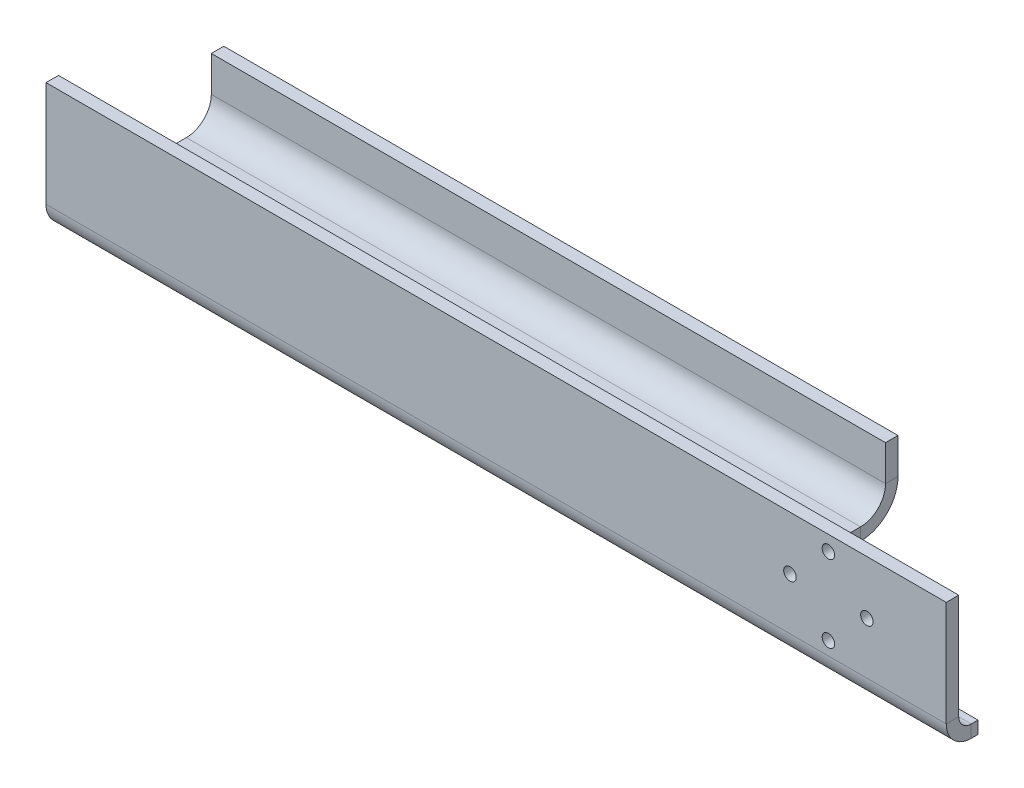
ISO-10303-21;
HEADER;
FILE_DESCRIPTION(('STEP AP214'),'2;1');
FILE_NAME('part.step','',(''),(''),'','','');
FILE_SCHEMA(('AUTOMOTIVE_DESIGN { 1 0 10303 214 1 1 1 1 }'));
ENDSEC;
DATA;
#1=APPLICATION_CONTEXT('core data for automotive mechanical design processes');
#2=APPLICATION_PROTOCOL_DEFINITION('international standard','automotive_design',2000,#1);
#3=PRODUCT_CONTEXT('',#1,'mechanical');
#4=PRODUCT('Part','Part','',(#3));
#5=PRODUCT_RELATED_PRODUCT_CATEGORY('part','',(#4));
#6=PRODUCT_DEFINITION_FORMATION('','',#4);
#7=PRODUCT_DEFINITION_CONTEXT('part definition',#1,'design');
#8=PRODUCT_DEFINITION('design','',#6,#7);
#9=PRODUCT_DEFINITION_SHAPE('','',#8);
#10=(LENGTH_UNIT() NAMED_UNIT(*) SI_UNIT(.MILLI.,.METRE.));
#11=(NAMED_UNIT(*) PLANE_ANGLE_UNIT() SI_UNIT($,.RADIAN.));
#12=(NAMED_UNIT(*) SI_UNIT($,.STERADIAN.) SOLID_ANGLE_UNIT());
#13=UNCERTAINTY_MEASURE_WITH_UNIT(LENGTH_MEASURE(1.E-05),#10,'distance_accuracy_value','');
#14=(GEOMETRIC_REPRESENTATION_CONTEXT(3) GLOBAL_UNCERTAINTY_ASSIGNED_CONTEXT((#13)) GLOBAL_UNIT_ASSIGNED_CONTEXT((#10,
#11,#12)) REPRESENTATION_CONTEXT('',''));
#15=CARTESIAN_POINT('',(0.,0.,0.));
#16=DIRECTION('',(0.,0.,1.));
#17=DIRECTION('',(1.,0.,0.));
#18=AXIS2_PLACEMENT_3D('',#15,#16,#17);
#19=CARTESIAN_POINT('',(0.,2.5,0.));
#20=DIRECTION('',(0.,1.,0.));
#21=DIRECTION('',(0.,0.,1.));
#22=AXIS2_PLACEMENT_3D('',#19,#20,#21);
#23=PLANE('',#22);
#24=CARTESIAN_POINT('',(5.44472221513645,2.5,5.44472221513638));
#25=DIRECTION('',(0.,1.,0.));
#26=DIRECTION('',(0.,0.,1.));
#27=AXIS2_PLACEMENT_3D('',#24,#25,#26);
#28=CIRCLE('',#27,1.3);
#29=CARTESIAN_POINT('',(5.44472221513645,2.5,6.74472221513639));
#30=VERTEX_POINT('',#29);
#31=EDGE_CURVE('E335',#30,#30,#28,.T.);
#32=ORIENTED_EDGE('',*,*,#31,.F.);
#33=EDGE_LOOP('',(#32));
#34=FACE_BOUND('',#33,.T.);
#35=CARTESIAN_POINT('',(-5.44472221513645,2.5,-5.44472221513639));
#36=DIRECTION('',(0.,1.,0.));
#37=DIRECTION('',(0.,0.,1.));
#38=AXIS2_PLACEMENT_3D('',#35,#36,#37);
#39=CIRCLE('',#38,1.3);
#40=CARTESIAN_POINT('',(-5.44472221513645,2.5,-4.14472221513639));
#41=VERTEX_POINT('',#40);
#42=EDGE_CURVE('E338',#41,#41,#39,.T.);
#43=ORIENTED_EDGE('',*,*,#42,.F.);
#44=EDGE_LOOP('',(#43));
#45=FACE_BOUND('',#44,.T.);
#46=CARTESIAN_POINT('',(5.44472221513639,2.5,-5.44472221513645));
#47=DIRECTION('',(0.,1.,0.));
#48=DIRECTION('',(0.,0.,1.));
#49=AXIS2_PLACEMENT_3D('',#46,#47,#48);
#50=CIRCLE('',#49,1.3);
#51=CARTESIAN_POINT('',(5.44472221513639,2.5,-4.14472221513645));
#52=VERTEX_POINT('',#51);
#53=EDGE_CURVE('E347',#52,#52,#50,.T.);
#54=ORIENTED_EDGE('',*,*,#53,.F.);
#55=EDGE_LOOP('',(#54));
#56=FACE_BOUND('',#55,.T.);
#57=CARTESIAN_POINT('',(-5.44472221513639,2.5,5.44472221513645));
#58=DIRECTION('',(0.,1.,0.));
#59=DIRECTION('',(0.,0.,1.));
#60=AXIS2_PLACEMENT_3D('',#57,#58,#59);
#61=CIRCLE('',#60,1.3);
#62=CARTESIAN_POINT('',(-5.44472221513639,2.5,6.74472221513644));
#63=VERTEX_POINT('',#62);
#64=EDGE_CURVE('E350',#63,#63,#61,.T.);
#65=ORIENTED_EDGE('',*,*,#64,.F.);
#66=EDGE_LOOP('',(#65));
#67=FACE_BOUND('',#66,.T.);
#68=DIRECTION('',(0.,0.,-1.));
#69=VECTOR('',#68,1.);
#70=CARTESIAN_POINT('',(119.20208345922,2.5,-27.));
#71=LINE('',#70,#69);
#72=CARTESIAN_POINT('',(119.20208345922,2.5,11.6459472433678));
#73=VERTEX_POINT('',#72);
#74=CARTESIAN_POINT('',(119.20208345922,2.5,-10.0912614787659));
#75=VERTEX_POINT('',#74);
#76=EDGE_CURVE('E57',#73,#75,#71,.T.);
#77=ORIENTED_EDGE('',*,*,#76,.T.);
#78=DIRECTION('',(-1.,0.,0.));
#79=VECTOR('',#78,1.);
#80=CARTESIAN_POINT('',(0.,2.5,-10.0912614787659));
#81=LINE('',#80,#79);
#82=CARTESIAN_POINT('',(-15.7697055104054,2.5,-10.0912614787659));
#83=VERTEX_POINT('',#82);
#84=EDGE_CURVE('E384',#75,#83,#81,.T.);
#85=ORIENTED_EDGE('',*,*,#84,.T.);
#86=DIRECTION('',(0.,0.,1.));
#87=VECTOR('',#86,1.);
#88=CARTESIAN_POINT('',(-15.7697055104054,2.5,-27.));
#89=LINE('',#88,#87);
#90=CARTESIAN_POINT('',(-15.7697055104054,2.5,13.0038202314015));
#91=VERTEX_POINT('',#90);
#92=EDGE_CURVE('E342',#83,#91,#89,.T.);
#93=ORIENTED_EDGE('',*,*,#92,.T.);
#94=DIRECTION('',(1.,0.,0.));
#95=VECTOR('',#94,1.);
#96=CARTESIAN_POINT('',(0.,2.5,13.0038202314015));
#97=LINE('',#96,#95);
#98=CARTESIAN_POINT('',(126.472678925557,2.5,13.0038202314015));
#99=VERTEX_POINT('',#98);
#100=EDGE_CURVE('E374',#91,#99,#97,.T.);
#101=ORIENTED_EDGE('',*,*,#100,.T.);
#102=DIRECTION('',(0.,0.,-1.));
#103=VECTOR('',#102,1.);
#104=CARTESIAN_POINT('',(126.472678925557,2.5,11.6459472433678));
#105=LINE('',#104,#103);
#106=CARTESIAN_POINT('',(126.472678925557,2.5,11.6459472433678));
#107=VERTEX_POINT('',#106);
#108=EDGE_CURVE('E346',#99,#107,#105,.T.);
#109=ORIENTED_EDGE('',*,*,#108,.T.);
#110=DIRECTION('',(-1.,0.,0.));
#111=VECTOR('',#110,1.);
#112=CARTESIAN_POINT('',(119.20208345922,2.5,11.6459472433678));
#113=LINE('',#112,#111);
#114=EDGE_CURVE('E343',#107,#73,#113,.T.);
#115=ORIENTED_EDGE('',*,*,#114,.T.);
#116=EDGE_LOOP('',(#77,#85,#93,#101,#109,#115));
#117=FACE_BOUND('',#116,.T.);
#118=ADVANCED_FACE('F53',(#34,#45,#56,#67,#117),#23,.T.);
#119=CARTESIAN_POINT('',(-15.7697055104054,2.5,-27.));
#120=DIRECTION('',(-1.,0.,0.));
#121=DIRECTION('',(0.,0.,1.));
#122=AXIS2_PLACEMENT_3D('',#119,#120,#121);
#123=PLANE('',#122);
#124=ORIENTED_EDGE('',*,*,#92,.F.);
#125=DIRECTION('',(0.,-1.,0.));
#126=VECTOR('',#125,1.);
#127=CARTESIAN_POINT('',(-15.7697055104054,2.5,-10.0912614787659));
#128=LINE('',#127,#126);
#129=CARTESIAN_POINT('',(-15.7697055104054,0.,-10.0912614787659));
#130=VERTEX_POINT('',#129);
#131=EDGE_CURVE('E12',#83,#130,#128,.T.);
#132=ORIENTED_EDGE('',*,*,#131,.T.);
#133=DIRECTION('',(0.,0.,1.));
#134=VECTOR('',#133,1.);
#135=CARTESIAN_POINT('',(-15.7697055104054,0.,0.));
#136=LINE('',#135,#134);
#137=CARTESIAN_POINT('',(-15.7697055104054,0.,13.0038202314015));
#138=VERTEX_POINT('',#137);
#139=EDGE_CURVE('E359',#130,#138,#136,.T.);
#140=ORIENTED_EDGE('',*,*,#139,.T.);
#141=DIRECTION('',(0.,1.,0.));
#142=VECTOR('',#141,1.);
#143=CARTESIAN_POINT('',(-15.7697055104054,2.5,13.0038202314015));
#144=LINE('',#143,#142);
#145=EDGE_CURVE('E377',#138,#91,#144,.T.);
#146=ORIENTED_EDGE('',*,*,#145,.T.);
#147=EDGE_LOOP('',(#124,#132,#140,#146));
#148=FACE_BOUND('',#147,.T.);
#149=ADVANCED_FACE('F55',(#148),#123,.T.);
#150=CARTESIAN_POINT('',(119.20208345922,2.5,-27.));
#151=DIRECTION('',(1.,0.,0.));
#152=DIRECTION('',(0.,0.,-1.));
#153=AXIS2_PLACEMENT_3D('',#150,#151,#152);
#154=PLANE('',#153);
#155=DIRECTION('',(0.,0.,1.));
#156=VECTOR('',#155,1.);
#157=CARTESIAN_POINT('',(119.20208345922,0.,0.));
#158=LINE('',#157,#156);
#159=CARTESIAN_POINT('',(119.20208345922,0.,11.6459472433678));
#160=VERTEX_POINT('',#159);
#161=CARTESIAN_POINT('',(119.20208345922,0.,-10.0912614787659));
#162=VERTEX_POINT('',#161);
#163=EDGE_CURVE('E363',#160,#162,#158,.F.);
#164=ORIENTED_EDGE('',*,*,#163,.T.);
#165=DIRECTION('',(0.,1.,0.));
#166=VECTOR('',#165,1.);
#167=CARTESIAN_POINT('',(119.20208345922,2.5,-10.0912614787659));
#168=LINE('',#167,#166);
#169=EDGE_CURVE('E389',#162,#75,#168,.T.);
#170=ORIENTED_EDGE('',*,*,#169,.T.);
#171=ORIENTED_EDGE('',*,*,#76,.F.);
#172=DIRECTION('',(0.,1.,0.));
#173=VECTOR('',#172,1.);
#174=CARTESIAN_POINT('',(119.20208345922,2.5,11.6459472433678));
#175=LINE('',#174,#173);
#176=EDGE_CURVE('E353',#160,#73,#175,.T.);
#177=ORIENTED_EDGE('',*,*,#176,.F.);
#178=EDGE_LOOP('',(#164,#170,#171,#177));
#179=FACE_BOUND('',#178,.T.);
#180=ADVANCED_FACE('F473',(#179),#154,.T.);
#181=CARTESIAN_POINT('',(0.,0.,0.));
#182=DIRECTION('',(0.,1.,0.));
#183=DIRECTION('',(0.,0.,1.));
#184=AXIS2_PLACEMENT_3D('',#181,#182,#183);
#185=PLANE('',#184);
#186=DIRECTION('',(-1.,0.,0.));
#187=VECTOR('',#186,1.);
#188=CARTESIAN_POINT('',(0.,0.,-10.0912614787659));
#189=LINE('',#188,#187);
#190=EDGE_CURVE('E62',#162,#130,#189,.T.);
#191=ORIENTED_EDGE('',*,*,#190,.F.);
#192=ORIENTED_EDGE('',*,*,#163,.F.);
#193=DIRECTION('',(1.,0.,0.));
#194=VECTOR('',#193,1.);
#195=CARTESIAN_POINT('',(0.,0.,11.6459472433678));
#196=LINE('',#195,#194);
#197=CARTESIAN_POINT('',(126.472678925557,0.,11.6459472433678));
#198=VERTEX_POINT('',#197);
#199=EDGE_CURVE('E360',#198,#160,#196,.F.);
#200=ORIENTED_EDGE('',*,*,#199,.F.);
#201=DIRECTION('',(0.,0.,1.));
#202=VECTOR('',#201,1.);
#203=CARTESIAN_POINT('',(126.472678925557,0.,0.));
#204=LINE('',#203,#202);
#205=CARTESIAN_POINT('',(126.472678925557,0.,13.0038202314015));
#206=VERTEX_POINT('',#205);
#207=EDGE_CURVE('E364',#206,#198,#204,.F.);
#208=ORIENTED_EDGE('',*,*,#207,.F.);
#209=DIRECTION('',(1.,0.,0.));
#210=VECTOR('',#209,1.);
#211=CARTESIAN_POINT('',(0.,0.,13.0038202314015));
#212=LINE('',#211,#210);
#213=EDGE_CURVE('E78',#138,#206,#212,.T.);
#214=ORIENTED_EDGE('',*,*,#213,.F.);
#215=ORIENTED_EDGE('',*,*,#139,.F.);
#216=EDGE_LOOP('',(#191,#192,#200,#208,#214,#215));
#217=FACE_BOUND('',#216,.T.);
#218=CARTESIAN_POINT('',(5.44472221513645,0.,5.44472221513638));
#219=DIRECTION('',(0.,1.,0.));
#220=DIRECTION('',(0.,0.,1.));
#221=AXIS2_PLACEMENT_3D('',#218,#219,#220);
#222=CIRCLE('',#221,1.3);
#223=CARTESIAN_POINT('',(5.44472221513645,0.,6.74472221513639));
#224=VERTEX_POINT('',#223);
#225=EDGE_CURVE('E306',#224,#224,#222,.T.);
#226=ORIENTED_EDGE('',*,*,#225,.T.);
#227=EDGE_LOOP('',(#226));
#228=FACE_BOUND('',#227,.T.);
#229=CARTESIAN_POINT('',(-5.44472221513645,0.,-5.44472221513639));
#230=DIRECTION('',(0.,1.,0.));
#231=DIRECTION('',(0.,0.,1.));
#232=AXIS2_PLACEMENT_3D('',#229,#230,#231);
#233=CIRCLE('',#232,1.3);
#234=CARTESIAN_POINT('',(-5.44472221513645,0.,-4.14472221513639));
#235=VERTEX_POINT('',#234);
#236=EDGE_CURVE('E356',#235,#235,#233,.T.);
#237=ORIENTED_EDGE('',*,*,#236,.T.);
#238=EDGE_LOOP('',(#237));
#239=FACE_BOUND('',#238,.T.);
#240=CARTESIAN_POINT('',(5.44472221513639,0.,-5.44472221513645));
#241=DIRECTION('',(0.,1.,0.));
#242=DIRECTION('',(0.,0.,1.));
#243=AXIS2_PLACEMENT_3D('',#240,#241,#242);
#244=CIRCLE('',#243,1.3);
#245=CARTESIAN_POINT('',(5.44472221513639,0.,-4.14472221513645));
#246=VERTEX_POINT('',#245);
#247=EDGE_CURVE('E365',#246,#246,#244,.T.);
#248=ORIENTED_EDGE('',*,*,#247,.T.);
#249=EDGE_LOOP('',(#248));
#250=FACE_BOUND('',#249,.T.);
#251=CARTESIAN_POINT('',(-5.44472221513639,0.,5.44472221513645));
#252=DIRECTION('',(0.,1.,0.));
#253=DIRECTION('',(0.,0.,1.));
#254=AXIS2_PLACEMENT_3D('',#251,#252,#253);
#255=CIRCLE('',#254,1.3);
#256=CARTESIAN_POINT('',(-5.44472221513639,0.,6.74472221513644));
#257=VERTEX_POINT('',#256);
#258=EDGE_CURVE('E339',#257,#257,#255,.T.);
#259=ORIENTED_EDGE('',*,*,#258,.T.);
#260=EDGE_LOOP('',(#259));
#261=FACE_BOUND('',#260,.T.);
#262=ADVANCED_FACE('F412',(#217,#228,#239,#250,#261),#185,.F.);
#263=CARTESIAN_POINT('',(126.472678925557,2.5,11.6459472433678));
#264=DIRECTION('',(1.,0.,0.));
#265=DIRECTION('',(0.,0.,-1.));
#266=AXIS2_PLACEMENT_3D('',#263,#264,#265);
#267=PLANE('',#266);
#268=ORIENTED_EDGE('',*,*,#108,.F.);
#269=DIRECTION('',(0.,-1.,0.));
#270=VECTOR('',#269,1.);
#271=CARTESIAN_POINT('',(126.472678925557,2.5,13.0038202314015));
#272=LINE('',#271,#270);
#273=EDGE_CURVE('E381',#99,#206,#272,.T.);
#274=ORIENTED_EDGE('',*,*,#273,.T.);
#275=ORIENTED_EDGE('',*,*,#207,.T.);
#276=DIRECTION('',(0.,1.,0.));
#277=VECTOR('',#276,1.);
#278=CARTESIAN_POINT('',(126.472678925557,2.5,11.6459472433678));
#279=LINE('',#278,#277);
#280=EDGE_CURVE('E371',#198,#107,#279,.T.);
#281=ORIENTED_EDGE('',*,*,#280,.T.);
#282=EDGE_LOOP('',(#268,#274,#275,#281));
#283=FACE_BOUND('',#282,.T.);
#284=ADVANCED_FACE('F419',(#283),#267,.T.);
#285=CARTESIAN_POINT('',(119.20208345922,2.5,11.6459472433678));
#286=DIRECTION('',(0.,0.,-1.));
#287=DIRECTION('',(-1.,0.,0.));
#288=AXIS2_PLACEMENT_3D('',#285,#286,#287);
#289=PLANE('',#288);
#290=ORIENTED_EDGE('',*,*,#280,.F.);
#291=ORIENTED_EDGE('',*,*,#199,.T.);
#292=ORIENTED_EDGE('',*,*,#176,.T.);
#293=ORIENTED_EDGE('',*,*,#114,.F.);
#294=EDGE_LOOP('',(#290,#291,#292,#293));
#295=FACE_BOUND('',#294,.T.);
#296=ADVANCED_FACE('F486',(#295),#289,.T.);
#297=CARTESIAN_POINT('',(5.44472221513645,2.5,5.44472221513638));
#298=DIRECTION('',(0.,1.,0.));
#299=DIRECTION('',(0.,0.,1.));
#300=AXIS2_PLACEMENT_3D('',#297,#298,#299);
#301=CYLINDRICAL_SURFACE('',#300,1.3);
#302=ORIENTED_EDGE('',*,*,#31,.T.);
#303=EDGE_LOOP('',(#302));
#304=FACE_BOUND('',#303,.T.);
#305=ORIENTED_EDGE('',*,*,#225,.F.);
#306=EDGE_LOOP('',(#305));
#307=FACE_BOUND('',#306,.T.);
#308=ADVANCED_FACE('F492',(#304,#307),#301,.F.);
#309=CARTESIAN_POINT('',(-5.44472221513645,2.5,-5.44472221513639));
#310=DIRECTION('',(0.,1.,0.));
#311=DIRECTION('',(0.,0.,1.));
#312=AXIS2_PLACEMENT_3D('',#309,#310,#311);
#313=CYLINDRICAL_SURFACE('',#312,1.3);
#314=ORIENTED_EDGE('',*,*,#42,.T.);
#315=EDGE_LOOP('',(#314));
#316=FACE_BOUND('',#315,.T.);
#317=ORIENTED_EDGE('',*,*,#236,.F.);
#318=EDGE_LOOP('',(#317));
#319=FACE_BOUND('',#318,.T.);
#320=ADVANCED_FACE('F498',(#316,#319),#313,.F.);
#321=CARTESIAN_POINT('',(5.44472221513639,2.5,-5.44472221513645));
#322=DIRECTION('',(0.,1.,0.));
#323=DIRECTION('',(0.,0.,1.));
#324=AXIS2_PLACEMENT_3D('',#321,#322,#323);
#325=CYLINDRICAL_SURFACE('',#324,1.3);
#326=ORIENTED_EDGE('',*,*,#53,.T.);
#327=EDGE_LOOP('',(#326));
#328=FACE_BOUND('',#327,.T.);
#329=ORIENTED_EDGE('',*,*,#247,.F.);
#330=EDGE_LOOP('',(#329));
#331=FACE_BOUND('',#330,.T.);
#332=ADVANCED_FACE('F503',(#328,#331),#325,.F.);
#333=CARTESIAN_POINT('',(-5.44472221513639,2.5,5.44472221513645));
#334=DIRECTION('',(0.,1.,0.));
#335=DIRECTION('',(0.,0.,1.));
#336=AXIS2_PLACEMENT_3D('',#333,#334,#335);
#337=CYLINDRICAL_SURFACE('',#336,1.3);
#338=ORIENTED_EDGE('',*,*,#64,.T.);
#339=EDGE_LOOP('',(#338));
#340=FACE_BOUND('',#339,.T.);
#341=ORIENTED_EDGE('',*,*,#258,.F.);
#342=EDGE_LOOP('',(#341));
#343=FACE_BOUND('',#342,.T.);
#344=ADVANCED_FACE('F505',(#340,#343),#337,.F.);
#345=CARTESIAN_POINT('',(-15.7697055104054,26.0827402990268,15.5038202314015));
#346=DIRECTION('',(0.,1.,0.));
#347=DIRECTION('',(1.,0.,0.));
#348=AXIS2_PLACEMENT_3D('',#345,#346,#347);
#349=PLANE('',#348);
#350=DIRECTION('',(1.,0.,0.));
#351=VECTOR('',#350,1.);
#352=CARTESIAN_POINT('',(0.,26.0827402990268,18.0038202314015));
#353=LINE('',#352,#351);
#354=CARTESIAN_POINT('',(-15.7697055104054,26.0827402990268,18.0038202314015));
#355=VERTEX_POINT('',#354);
#356=CARTESIAN_POINT('',(164.453532393305,26.0827402990268,18.0038202314015));
#357=VERTEX_POINT('',#356);
#358=EDGE_CURVE('E324',#355,#357,#353,.T.);
#359=ORIENTED_EDGE('',*,*,#358,.T.);
#360=DIRECTION('',(0.,0.,-1.));
#361=VECTOR('',#360,1.);
#362=CARTESIAN_POINT('',(164.453532393305,26.0827402990268,15.5038202314015));
#363=LINE('',#362,#361);
#364=CARTESIAN_POINT('',(164.453532393305,26.0827402990268,15.5038202314015));
#365=VERTEX_POINT('',#364);
#366=EDGE_CURVE('E322',#357,#365,#363,.T.);
#367=ORIENTED_EDGE('',*,*,#366,.T.);
#368=DIRECTION('',(1.,0.,0.));
#369=VECTOR('',#368,1.);
#370=CARTESIAN_POINT('',(-15.7697055104054,26.0827402990268,15.5038202314015));
#371=LINE('',#370,#369);
#372=CARTESIAN_POINT('',(-15.7697055104054,26.0827402990268,15.5038202314015));
#373=VERTEX_POINT('',#372);
#374=EDGE_CURVE('E317',#373,#365,#371,.T.);
#375=ORIENTED_EDGE('',*,*,#374,.F.);
#376=DIRECTION('',(0.,0.,-1.));
#377=VECTOR('',#376,1.);
#378=CARTESIAN_POINT('',(-15.7697055104054,26.0827402990268,15.5038202314015));
#379=LINE('',#378,#377);
#380=EDGE_CURVE('E310',#355,#373,#379,.T.);
#381=ORIENTED_EDGE('',*,*,#380,.F.);
#382=EDGE_LOOP('',(#359,#367,#375,#381));
#383=FACE_BOUND('',#382,.T.);
#384=ADVANCED_FACE('F507',(#383),#349,.T.);
#385=CARTESIAN_POINT('',(0.,-13.8943064568824,15.5038202314016));
#386=DIRECTION('',(0.,0.,-1.));
#387=DIRECTION('',(0.,1.,0.));
#388=AXIS2_PLACEMENT_3D('',#385,#386,#387);
#389=PLANE('',#388);
#390=CARTESIAN_POINT('',(140.861538461537,23.0712554562547,15.5038202314015));
#391=DIRECTION('',(0.,0.,-1.));
#392=DIRECTION('',(0.,1.,0.));
#393=AXIS2_PLACEMENT_3D('',#390,#391,#392);
#394=CIRCLE('',#393,1.25000000000001);
#395=CARTESIAN_POINT('',(140.861538461537,24.3212554562547,15.5038202314015));
#396=VERTEX_POINT('',#395);
#397=EDGE_CURVE('E977',#396,#396,#394,.T.);
#398=ORIENTED_EDGE('',*,*,#397,.F.);
#399=EDGE_LOOP('',(#398));
#400=FACE_BOUND('',#399,.T.);
#401=CARTESIAN_POINT('',(133.161538461537,15.3712554562547,15.5038202314015));
#402=DIRECTION('',(0.,0.,-1.));
#403=DIRECTION('',(0.,1.,0.));
#404=AXIS2_PLACEMENT_3D('',#401,#402,#403);
#405=CIRCLE('',#404,1.25000000000001);
#406=CARTESIAN_POINT('',(133.161538461537,16.6212554562547,15.5038202314015));
#407=VERTEX_POINT('',#406);
#408=EDGE_CURVE('E978',#407,#407,#405,.T.);
#409=ORIENTED_EDGE('',*,*,#408,.F.);
#410=EDGE_LOOP('',(#409));
#411=FACE_BOUND('',#410,.T.);
#412=CARTESIAN_POINT('',(140.861538461537,7.67125545625473,15.5038202314015));
#413=DIRECTION('',(0.,0.,-1.));
#414=DIRECTION('',(0.,1.,0.));
#415=AXIS2_PLACEMENT_3D('',#412,#413,#414);
#416=CIRCLE('',#415,1.25000000000001);
#417=CARTESIAN_POINT('',(140.861538461537,8.92125545625474,15.5038202314015));
#418=VERTEX_POINT('',#417);
#419=EDGE_CURVE('E987',#418,#418,#416,.T.);
#420=ORIENTED_EDGE('',*,*,#419,.F.);
#421=EDGE_LOOP('',(#420));
#422=FACE_BOUND('',#421,.T.);
#423=CARTESIAN_POINT('',(148.561538461537,15.3712554562547,15.5038202314015));
#424=DIRECTION('',(0.,0.,-1.));
#425=DIRECTION('',(0.,1.,0.));
#426=AXIS2_PLACEMENT_3D('',#423,#424,#425);
#427=CIRCLE('',#426,1.25000000000001);
#428=CARTESIAN_POINT('',(148.561538461537,16.6212554562547,15.5038202314015));
#429=VERTEX_POINT('',#428);
#430=EDGE_CURVE('E993',#429,#429,#427,.T.);
#431=ORIENTED_EDGE('',*,*,#430,.F.);
#432=EDGE_LOOP('',(#431));
#433=FACE_BOUND('',#432,.T.);
#434=DIRECTION('',(1.,0.,0.));
#435=VECTOR('',#434,1.);
#436=CARTESIAN_POINT('',(0.,4.99999999999999,15.5038202314015));
#437=LINE('',#436,#435);
#438=CARTESIAN_POINT('',(-15.7697055104054,5.,15.5038202314015));
#439=VERTEX_POINT('',#438);
#440=CARTESIAN_POINT('',(164.453532393305,5.00000000000001,15.5038202314015));
#441=VERTEX_POINT('',#440);
#442=EDGE_CURVE('E303',#439,#441,#437,.T.);
#443=ORIENTED_EDGE('',*,*,#442,.F.);
#444=DIRECTION('',(0.,1.,0.));
#445=VECTOR('',#444,1.);
#446=CARTESIAN_POINT('',(-15.7697055104053,-40.8943064568824,15.5038202314017));
#447=LINE('',#446,#445);
#448=EDGE_CURVE('E320',#439,#373,#447,.T.);
#449=ORIENTED_EDGE('',*,*,#448,.T.);
#450=ORIENTED_EDGE('',*,*,#374,.T.);
#451=DIRECTION('',(0.,-1.,0.));
#452=VECTOR('',#451,1.);
#453=CARTESIAN_POINT('',(164.453532393305,26.0827402990268,15.5038202314015));
#454=LINE('',#453,#452);
#455=EDGE_CURVE('E315',#365,#441,#454,.T.);
#456=ORIENTED_EDGE('',*,*,#455,.T.);
#457=EDGE_LOOP('',(#443,#449,#450,#456));
#458=FACE_BOUND('',#457,.T.);
#459=ADVANCED_FACE('F511',(#400,#411,#422,#433,#458),#389,.T.);
#460=CARTESIAN_POINT('',(-15.7697055104053,-40.8943064568824,15.5038202314017));
#461=DIRECTION('',(-1.,0.,0.));
#462=DIRECTION('',(0.,1.,0.));
#463=AXIS2_PLACEMENT_3D('',#460,#461,#462);
#464=PLANE('',#463);
#465=DIRECTION('',(0.,0.,-1.));
#466=VECTOR('',#465,1.);
#467=CARTESIAN_POINT('',(-15.7697055104054,4.99999999999999,15.5038202314015));
#468=LINE('',#467,#466);
#469=CARTESIAN_POINT('',(-15.7697055104054,5.,18.0038202314016));
#470=VERTEX_POINT('',#469);
#471=EDGE_CURVE('E327',#470,#439,#468,.T.);
#472=ORIENTED_EDGE('',*,*,#471,.F.);
#473=DIRECTION('',(0.,1.,0.));
#474=VECTOR('',#473,1.);
#475=CARTESIAN_POINT('',(-15.7697055104054,-13.8943064568824,18.0038202314016));
#476=LINE('',#475,#474);
#477=EDGE_CURVE('E313',#470,#355,#476,.T.);
#478=ORIENTED_EDGE('',*,*,#477,.T.);
#479=ORIENTED_EDGE('',*,*,#380,.T.);
#480=ORIENTED_EDGE('',*,*,#448,.F.);
#481=EDGE_LOOP('',(#472,#478,#479,#480));
#482=FACE_BOUND('',#481,.T.);
#483=ADVANCED_FACE('F523',(#482),#464,.T.);
#484=CARTESIAN_POINT('',(0.,-13.8943064568824,18.0038202314016));
#485=DIRECTION('',(0.,0.,-1.));
#486=DIRECTION('',(0.,1.,0.));
#487=AXIS2_PLACEMENT_3D('',#484,#485,#486);
#488=PLANE('',#487);
#489=CARTESIAN_POINT('',(140.861538461537,23.0712554562547,18.0038202314016));
#490=DIRECTION('',(0.,0.,-1.));
#491=DIRECTION('',(0.,1.,0.));
#492=AXIS2_PLACEMENT_3D('',#489,#490,#491);
#493=CIRCLE('',#492,1.25000000000001);
#494=CARTESIAN_POINT('',(140.861538461537,24.3212554562548,18.0038202314016));
#495=VERTEX_POINT('',#494);
#496=EDGE_CURVE('E230',#495,#495,#493,.T.);
#497=ORIENTED_EDGE('',*,*,#496,.T.);
#498=EDGE_LOOP('',(#497));
#499=FACE_BOUND('',#498,.T.);
#500=CARTESIAN_POINT('',(133.161538461537,15.3712554562547,18.0038202314016));
#501=DIRECTION('',(0.,0.,-1.));
#502=DIRECTION('',(0.,1.,0.));
#503=AXIS2_PLACEMENT_3D('',#500,#501,#502);
#504=CIRCLE('',#503,1.25000000000001);
#505=CARTESIAN_POINT('',(133.161538461537,16.6212554562547,18.0038202314016));
#506=VERTEX_POINT('',#505);
#507=EDGE_CURVE('E982',#506,#506,#504,.T.);
#508=ORIENTED_EDGE('',*,*,#507,.T.);
#509=EDGE_LOOP('',(#508));
#510=FACE_BOUND('',#509,.T.);
#511=CARTESIAN_POINT('',(140.861538461537,7.67125545625474,18.0038202314016));
#512=DIRECTION('',(0.,0.,-1.));
#513=DIRECTION('',(0.,1.,0.));
#514=AXIS2_PLACEMENT_3D('',#511,#512,#513);
#515=CIRCLE('',#514,1.25000000000001);
#516=CARTESIAN_POINT('',(140.861538461537,8.92125545625475,18.0038202314016));
#517=VERTEX_POINT('',#516);
#518=EDGE_CURVE('E990',#517,#517,#515,.T.);
#519=ORIENTED_EDGE('',*,*,#518,.T.);
#520=EDGE_LOOP('',(#519));
#521=FACE_BOUND('',#520,.T.);
#522=CARTESIAN_POINT('',(148.561538461537,15.3712554562547,18.0038202314016));
#523=DIRECTION('',(0.,0.,-1.));
#524=DIRECTION('',(0.,1.,0.));
#525=AXIS2_PLACEMENT_3D('',#522,#523,#524);
#526=CIRCLE('',#525,1.25000000000001);
#527=CARTESIAN_POINT('',(148.561538461537,16.6212554562548,18.0038202314016));
#528=VERTEX_POINT('',#527);
#529=EDGE_CURVE('E996',#528,#528,#526,.T.);
#530=ORIENTED_EDGE('',*,*,#529,.T.);
#531=EDGE_LOOP('',(#530));
#532=FACE_BOUND('',#531,.T.);
#533=ORIENTED_EDGE('',*,*,#477,.F.);
#534=DIRECTION('',(1.,0.,0.));
#535=VECTOR('',#534,1.);
#536=CARTESIAN_POINT('',(0.,5.,18.0038202314016));
#537=LINE('',#536,#535);
#538=CARTESIAN_POINT('',(164.453532393305,5.,18.0038202314015));
#539=VERTEX_POINT('',#538);
#540=EDGE_CURVE('E307',#470,#539,#537,.T.);
#541=ORIENTED_EDGE('',*,*,#540,.T.);
#542=DIRECTION('',(0.,1.,0.));
#543=VECTOR('',#542,1.);
#544=CARTESIAN_POINT('',(164.453532393305,-13.8943064568824,18.0038202314016));
#545=LINE('',#544,#543);
#546=EDGE_CURVE('E304',#357,#539,#545,.F.);
#547=ORIENTED_EDGE('',*,*,#546,.F.);
#548=ORIENTED_EDGE('',*,*,#358,.F.);
#549=EDGE_LOOP('',(#533,#541,#547,#548));
#550=FACE_BOUND('',#549,.T.);
#551=ADVANCED_FACE('F530',(#499,#510,#521,#532,#550),#488,.F.);
#552=CARTESIAN_POINT('',(164.453532393305,26.0827402990268,15.5038202314015));
#553=DIRECTION('',(1.,0.,0.));
#554=DIRECTION('',(0.,-1.,0.));
#555=AXIS2_PLACEMENT_3D('',#552,#553,#554);
#556=PLANE('',#555);
#557=DIRECTION('',(0.,0.,1.));
#558=VECTOR('',#557,1.);
#559=CARTESIAN_POINT('',(164.453532393305,4.99999999999999,15.5038202314015));
#560=LINE('',#559,#558);
#561=EDGE_CURVE('E330',#441,#539,#560,.T.);
#562=ORIENTED_EDGE('',*,*,#561,.F.);
#563=ORIENTED_EDGE('',*,*,#455,.F.);
#564=ORIENTED_EDGE('',*,*,#366,.F.);
#565=ORIENTED_EDGE('',*,*,#546,.T.);
#566=EDGE_LOOP('',(#562,#563,#564,#565));
#567=FACE_BOUND('',#566,.T.);
#568=ADVANCED_FACE('F534',(#567),#556,.T.);
#569=CARTESIAN_POINT('',(-15.7697055104054,5.,13.0038202314015));
#570=DIRECTION('',(1.,0.,0.));
#571=DIRECTION('',(0.,0.,-1.));
#572=AXIS2_PLACEMENT_3D('',#569,#570,#571);
#573=PLANE('',#572);
#574=ORIENTED_EDGE('',*,*,#145,.F.);
#575=CARTESIAN_POINT('',(-15.7697055104054,5.,13.0038202314015));
#576=DIRECTION('',(1.,0.,0.));
#577=DIRECTION('',(0.,0.,-1.));
#578=AXIS2_PLACEMENT_3D('',#575,#576,#577);
#579=CIRCLE('',#578,5.);
#580=EDGE_CURVE('E243',#138,#470,#579,.F.);
#581=ORIENTED_EDGE('',*,*,#580,.T.);
#582=ORIENTED_EDGE('',*,*,#471,.T.);
#583=CARTESIAN_POINT('',(-15.7697055104054,5.,13.0038202314015));
#584=DIRECTION('',(-1.,0.,0.));
#585=DIRECTION('',(0.,0.,1.));
#586=AXIS2_PLACEMENT_3D('',#583,#584,#585);
#587=CIRCLE('',#586,2.5);
#588=EDGE_CURVE('E271',#91,#439,#587,.T.);
#589=ORIENTED_EDGE('',*,*,#588,.F.);
#590=EDGE_LOOP('',(#574,#581,#582,#589));
#591=FACE_BOUND('',#590,.T.);
#592=ADVANCED_FACE('F404',(#591),#573,.F.);
#593=CARTESIAN_POINT('',(164.453532393305,5.,13.0038202314015));
#594=DIRECTION('',(-1.,0.,0.));
#595=DIRECTION('',(0.,0.,1.));
#596=AXIS2_PLACEMENT_3D('',#593,#594,#595);
#597=PLANE('',#596);
#598=ORIENTED_EDGE('',*,*,#561,.T.);
#599=CARTESIAN_POINT('',(164.453532393305,5.,13.0038202314015));
#600=DIRECTION('',(1.,0.,0.));
#601=DIRECTION('',(0.,0.,-1.));
#602=AXIS2_PLACEMENT_3D('',#599,#600,#601);
#603=CIRCLE('',#602,5.);
#604=CARTESIAN_POINT('',(164.453532393305,0.,13.0038202314015));
#605=VERTEX_POINT('',#604);
#606=EDGE_CURVE('E295',#539,#605,#603,.T.);
#607=ORIENTED_EDGE('',*,*,#606,.T.);
#608=DIRECTION('',(0.,-1.,0.));
#609=VECTOR('',#608,1.);
#610=CARTESIAN_POINT('',(164.453532393305,2.5,13.0038202314015));
#611=LINE('',#610,#609);
#612=CARTESIAN_POINT('',(164.453532393305,2.5,13.0038202314015));
#613=VERTEX_POINT('',#612);
#614=EDGE_CURVE('E251',#613,#605,#611,.T.);
#615=ORIENTED_EDGE('',*,*,#614,.F.);
#616=CARTESIAN_POINT('',(164.453532393305,5.,13.0038202314015));
#617=DIRECTION('',(1.,0.,0.));
#618=DIRECTION('',(0.,0.,-1.));
#619=AXIS2_PLACEMENT_3D('',#616,#617,#618);
#620=CIRCLE('',#619,2.5);
#621=EDGE_CURVE('E274',#441,#613,#620,.T.);
#622=ORIENTED_EDGE('',*,*,#621,.F.);
#623=EDGE_LOOP('',(#598,#607,#615,#622));
#624=FACE_BOUND('',#623,.T.);
#625=ADVANCED_FACE('F444',(#624),#597,.F.);
#626=CARTESIAN_POINT('',(156.140604556731,5.,13.0038202314015));
#627=DIRECTION('',(1.,0.,0.));
#628=DIRECTION('',(0.,0.,-1.));
#629=AXIS2_PLACEMENT_3D('',#626,#627,#628);
#630=PLANE('',#629);
#631=DIRECTION('',(0.,1.,0.));
#632=VECTOR('',#631,1.);
#633=CARTESIAN_POINT('',(156.140604556731,2.5,13.0038202314015));
#634=LINE('',#633,#632);
#635=CARTESIAN_POINT('',(156.140604556731,0.,13.0038202314015));
#636=VERTEX_POINT('',#635);
#637=CARTESIAN_POINT('',(156.140604556731,2.5,13.0038202314015));
#638=VERTEX_POINT('',#637);
#639=EDGE_CURVE('E241',#636,#638,#634,.T.);
#640=ORIENTED_EDGE('',*,*,#639,.F.);
#641=CARTESIAN_POINT('',(156.140604556731,5.,13.0038202314015));
#642=DIRECTION('',(1.,0.,0.));
#643=DIRECTION('',(0.,0.,-1.));
#644=AXIS2_PLACEMENT_3D('',#641,#642,#643);
#645=CIRCLE('',#644,5.);
#646=CARTESIAN_POINT('',(156.140604556731,0.666013758597375,15.4971239151378));
#647=VERTEX_POINT('',#646);
#648=EDGE_CURVE('E292',#636,#647,#645,.F.);
#649=ORIENTED_EDGE('',*,*,#648,.T.);
#650=DIRECTION('',(0.,0.866797248280525,-0.49866073674725));
#651=VECTOR('',#650,1.);
#652=CARTESIAN_POINT('',(156.140604556731,2.83300687929869,14.2504720732696));
#653=LINE('',#652,#651);
#654=CARTESIAN_POINT('',(156.140604556731,2.83300687929869,14.2504720732696));
#655=VERTEX_POINT('',#654);
#656=EDGE_CURVE('E301',#647,#655,#653,.T.);
#657=ORIENTED_EDGE('',*,*,#656,.T.);
#658=CARTESIAN_POINT('',(156.140604556731,5.,13.0038202314015));
#659=DIRECTION('',(-1.,0.,0.));
#660=DIRECTION('',(0.,0.,1.));
#661=AXIS2_PLACEMENT_3D('',#658,#659,#660);
#662=CIRCLE('',#661,2.5);
#663=EDGE_CURVE('E278',#638,#655,#662,.T.);
#664=ORIENTED_EDGE('',*,*,#663,.F.);
#665=EDGE_LOOP('',(#640,#649,#657,#664));
#666=FACE_BOUND('',#665,.T.);
#667=ADVANCED_FACE('F431',(#666),#630,.F.);
#668=CARTESIAN_POINT('',(141.306641741144,2.83300687929869,14.2504720732696));
#669=DIRECTION('',(0.,0.498660736747249,0.866797248280525));
#670=DIRECTION('',(-1.,0.,0.));
#671=AXIS2_PLACEMENT_3D('',#668,#669,#670);
#672=PLANE('',#671);
#673=ORIENTED_EDGE('',*,*,#656,.F.);
#674=DIRECTION('',(1.,0.,0.));
#675=VECTOR('',#674,1.);
#676=CARTESIAN_POINT('',(-20.039736721453,0.666013758597375,15.4971239151378));
#677=LINE('',#676,#675);
#678=CARTESIAN_POINT('',(126.472678925557,0.666013758597375,15.4971239151378));
#679=VERTEX_POINT('',#678);
#680=EDGE_CURVE('E289',#647,#679,#677,.F.);
#681=ORIENTED_EDGE('',*,*,#680,.T.);
#682=DIRECTION('',(0.,0.866797248280526,-0.498660736747249));
#683=VECTOR('',#682,1.);
#684=CARTESIAN_POINT('',(126.472678925557,2.83300687929869,14.2504720732696));
#685=LINE('',#684,#683);
#686=CARTESIAN_POINT('',(126.472678925557,2.83300687929869,14.2504720732696));
#687=VERTEX_POINT('',#686);
#688=EDGE_CURVE('E287',#679,#687,#685,.T.);
#689=ORIENTED_EDGE('',*,*,#688,.T.);
#690=DIRECTION('',(-1.,0.,0.));
#691=VECTOR('',#690,1.);
#692=CARTESIAN_POINT('',(156.140604556731,2.83300687929869,14.2504720732696));
#693=LINE('',#692,#691);
#694=EDGE_CURVE('E281',#655,#687,#693,.T.);
#695=ORIENTED_EDGE('',*,*,#694,.F.);
#696=EDGE_LOOP('',(#673,#681,#689,#695));
#697=FACE_BOUND('',#696,.T.);
#698=ADVANCED_FACE('F426',(#697),#672,.F.);
#699=CARTESIAN_POINT('',(126.472678925557,5.,13.0038202314015));
#700=DIRECTION('',(-1.,0.,0.));
#701=DIRECTION('',(0.,0.,1.));
#702=AXIS2_PLACEMENT_3D('',#699,#700,#701);
#703=PLANE('',#702);
#704=ORIENTED_EDGE('',*,*,#688,.F.);
#705=CARTESIAN_POINT('',(126.472678925557,5.,13.0038202314015));
#706=DIRECTION('',(1.,0.,0.));
#707=DIRECTION('',(0.,0.,-1.));
#708=AXIS2_PLACEMENT_3D('',#705,#706,#707);
#709=CIRCLE('',#708,5.);
#710=EDGE_CURVE('E275',#679,#206,#709,.T.);
#711=ORIENTED_EDGE('',*,*,#710,.T.);
#712=ORIENTED_EDGE('',*,*,#273,.F.);
#713=CARTESIAN_POINT('',(126.472678925557,5.,13.0038202314015));
#714=DIRECTION('',(1.,0.,0.));
#715=DIRECTION('',(0.,0.,-1.));
#716=AXIS2_PLACEMENT_3D('',#713,#714,#715);
#717=CIRCLE('',#716,2.5);
#718=EDGE_CURVE('E284',#687,#99,#717,.T.);
#719=ORIENTED_EDGE('',*,*,#718,.F.);
#720=EDGE_LOOP('',(#704,#711,#712,#719));
#721=FACE_BOUND('',#720,.T.);
#722=ADVANCED_FACE('F421',(#721),#703,.F.);
#723=CARTESIAN_POINT('',(-20.039736721453,5.,13.0038202314015));
#724=DIRECTION('',(1.,0.,0.));
#725=DIRECTION('',(0.,0.,-1.));
#726=AXIS2_PLACEMENT_3D('',#723,#724,#725);
#727=CYLINDRICAL_SURFACE('',#726,2.5);
#728=ORIENTED_EDGE('',*,*,#718,.T.);
#729=ORIENTED_EDGE('',*,*,#100,.F.);
#730=ORIENTED_EDGE('',*,*,#588,.T.);
#731=ORIENTED_EDGE('',*,*,#442,.T.);
#732=ORIENTED_EDGE('',*,*,#621,.T.);
#733=DIRECTION('',(1.,0.,0.));
#734=VECTOR('',#733,1.);
#735=CARTESIAN_POINT('',(0.,2.5,13.0038202314015));
#736=LINE('',#735,#734);
#737=EDGE_CURVE('E259',#638,#613,#736,.T.);
#738=ORIENTED_EDGE('',*,*,#737,.F.);
#739=ORIENTED_EDGE('',*,*,#663,.T.);
#740=ORIENTED_EDGE('',*,*,#694,.T.);
#741=EDGE_LOOP('',(#728,#729,#730,#731,#732,#738,#739,#740));
#742=FACE_BOUND('',#741,.T.);
#743=ADVANCED_FACE('F407',(#742),#727,.F.);
#744=CARTESIAN_POINT('',(-20.039736721453,5.,13.0038202314015));
#745=DIRECTION('',(1.,0.,0.));
#746=DIRECTION('',(0.,0.,-1.));
#747=AXIS2_PLACEMENT_3D('',#744,#745,#746);
#748=CYLINDRICAL_SURFACE('',#747,5.);
#749=ORIENTED_EDGE('',*,*,#710,.F.);
#750=ORIENTED_EDGE('',*,*,#680,.F.);
#751=ORIENTED_EDGE('',*,*,#648,.F.);
#752=DIRECTION('',(1.,0.,0.));
#753=VECTOR('',#752,1.);
#754=CARTESIAN_POINT('',(0.,0.,13.0038202314015));
#755=LINE('',#754,#753);
#756=EDGE_CURVE('E237',#636,#605,#755,.T.);
#757=ORIENTED_EDGE('',*,*,#756,.T.);
#758=ORIENTED_EDGE('',*,*,#606,.F.);
#759=ORIENTED_EDGE('',*,*,#540,.F.);
#760=ORIENTED_EDGE('',*,*,#580,.F.);
#761=ORIENTED_EDGE('',*,*,#213,.T.);
#762=EDGE_LOOP('',(#749,#750,#751,#757,#758,#759,#760,#761));
#763=FACE_BOUND('',#762,.T.);
#764=ADVANCED_FACE('F423',(#763),#748,.T.);
#765=CARTESIAN_POINT('',(156.140604556731,2.5,11.6459472433678));
#766=DIRECTION('',(0.,0.,-1.));
#767=DIRECTION('',(-1.,0.,0.));
#768=AXIS2_PLACEMENT_3D('',#765,#766,#767);
#769=PLANE('',#768);
#770=DIRECTION('',(0.,1.,0.));
#771=VECTOR('',#770,1.);
#772=CARTESIAN_POINT('',(164.453532393305,2.5,11.6459472433678));
#773=LINE('',#772,#771);
#774=CARTESIAN_POINT('',(164.453532393305,0.,11.6459472433678));
#775=VERTEX_POINT('',#774);
#776=CARTESIAN_POINT('',(164.453532393305,2.5,11.6459472433678));
#777=VERTEX_POINT('',#776);
#778=EDGE_CURVE('E246',#775,#777,#773,.T.);
#779=ORIENTED_EDGE('',*,*,#778,.F.);
#780=DIRECTION('',(1.,0.,0.));
#781=VECTOR('',#780,1.);
#782=CARTESIAN_POINT('',(0.,0.,11.6459472433678));
#783=LINE('',#782,#781);
#784=CARTESIAN_POINT('',(156.140604556731,0.,11.6459472433678));
#785=VERTEX_POINT('',#784);
#786=EDGE_CURVE('E266',#775,#785,#783,.F.);
#787=ORIENTED_EDGE('',*,*,#786,.T.);
#788=DIRECTION('',(0.,1.,0.));
#789=VECTOR('',#788,1.);
#790=CARTESIAN_POINT('',(156.140604556731,2.5,11.6459472433678));
#791=LINE('',#790,#789);
#792=CARTESIAN_POINT('',(156.140604556731,2.5,11.6459472433678));
#793=VERTEX_POINT('',#792);
#794=EDGE_CURVE('E264',#785,#793,#791,.T.);
#795=ORIENTED_EDGE('',*,*,#794,.T.);
#796=DIRECTION('',(-1.,0.,0.));
#797=VECTOR('',#796,1.);
#798=CARTESIAN_POINT('',(156.140604556731,2.5,11.6459472433678));
#799=LINE('',#798,#797);
#800=EDGE_CURVE('E254',#777,#793,#799,.T.);
#801=ORIENTED_EDGE('',*,*,#800,.F.);
#802=EDGE_LOOP('',(#779,#787,#795,#801));
#803=FACE_BOUND('',#802,.T.);
#804=ADVANCED_FACE('F456',(#803),#769,.T.);
#805=CARTESIAN_POINT('',(0.,2.5,0.));
#806=DIRECTION('',(0.,1.,0.));
#807=DIRECTION('',(0.,0.,1.));
#808=AXIS2_PLACEMENT_3D('',#805,#806,#807);
#809=PLANE('',#808);
#810=DIRECTION('',(0.,0.,1.));
#811=VECTOR('',#810,1.);
#812=CARTESIAN_POINT('',(156.140604556731,2.5,11.6459472433678));
#813=LINE('',#812,#811);
#814=EDGE_CURVE('E261',#793,#638,#813,.T.);
#815=ORIENTED_EDGE('',*,*,#814,.T.);
#816=ORIENTED_EDGE('',*,*,#737,.T.);
#817=DIRECTION('',(0.,0.,-1.));
#818=VECTOR('',#817,1.);
#819=CARTESIAN_POINT('',(164.453532393305,2.5,39.9770467559092));
#820=LINE('',#819,#818);
#821=EDGE_CURVE('E257',#613,#777,#820,.T.);
#822=ORIENTED_EDGE('',*,*,#821,.T.);
#823=ORIENTED_EDGE('',*,*,#800,.T.);
#824=EDGE_LOOP('',(#815,#816,#822,#823));
#825=FACE_BOUND('',#824,.T.);
#826=ADVANCED_FACE('F436',(#825),#809,.T.);
#827=CARTESIAN_POINT('',(164.453532393305,2.5,39.9770467559092));
#828=DIRECTION('',(1.,0.,0.));
#829=DIRECTION('',(0.,0.,-1.));
#830=AXIS2_PLACEMENT_3D('',#827,#828,#829);
#831=PLANE('',#830);
#832=ORIENTED_EDGE('',*,*,#821,.F.);
#833=ORIENTED_EDGE('',*,*,#614,.T.);
#834=DIRECTION('',(0.,0.,1.));
#835=VECTOR('',#834,1.);
#836=CARTESIAN_POINT('',(164.453532393305,0.,0.));
#837=LINE('',#836,#835);
#838=EDGE_CURVE('E249',#605,#775,#837,.F.);
#839=ORIENTED_EDGE('',*,*,#838,.T.);
#840=ORIENTED_EDGE('',*,*,#778,.T.);
#841=EDGE_LOOP('',(#832,#833,#839,#840));
#842=FACE_BOUND('',#841,.T.);
#843=ADVANCED_FACE('F440',(#842),#831,.T.);
#844=CARTESIAN_POINT('',(0.,0.,0.));
#845=DIRECTION('',(0.,1.,0.));
#846=DIRECTION('',(0.,0.,1.));
#847=AXIS2_PLACEMENT_3D('',#844,#845,#846);
#848=PLANE('',#847);
#849=ORIENTED_EDGE('',*,*,#756,.F.);
#850=DIRECTION('',(0.,0.,1.));
#851=VECTOR('',#850,1.);
#852=CARTESIAN_POINT('',(156.140604556731,0.,0.));
#853=LINE('',#852,#851);
#854=EDGE_CURVE('E244',#785,#636,#853,.T.);
#855=ORIENTED_EDGE('',*,*,#854,.F.);
#856=ORIENTED_EDGE('',*,*,#786,.F.);
#857=ORIENTED_EDGE('',*,*,#838,.F.);
#858=EDGE_LOOP('',(#849,#855,#856,#857));
#859=FACE_BOUND('',#858,.T.);
#860=ADVANCED_FACE('F451',(#859),#848,.F.);
#861=CARTESIAN_POINT('',(156.140604556731,2.5,11.6459472433678));
#862=DIRECTION('',(-1.,0.,0.));
#863=DIRECTION('',(0.,0.,1.));
#864=AXIS2_PLACEMENT_3D('',#861,#862,#863);
#865=PLANE('',#864);
#866=ORIENTED_EDGE('',*,*,#854,.T.);
#867=ORIENTED_EDGE('',*,*,#639,.T.);
#868=ORIENTED_EDGE('',*,*,#814,.F.);
#869=ORIENTED_EDGE('',*,*,#794,.F.);
#870=EDGE_LOOP('',(#866,#867,#868,#869));
#871=FACE_BOUND('',#870,.T.);
#872=ADVANCED_FACE('F454',(#871),#865,.T.);
#873=CARTESIAN_POINT('',(119.20208345922,7.5,-10.0912614787659));
#874=DIRECTION('',(-1.,0.,0.));
#875=DIRECTION('',(0.,0.,1.));
#876=AXIS2_PLACEMENT_3D('',#873,#874,#875);
#877=PLANE('',#876);
#878=ORIENTED_EDGE('',*,*,#169,.F.);
#879=CARTESIAN_POINT('',(119.20208345922,7.5,-10.0912614787659));
#880=DIRECTION('',(-1.,0.,0.));
#881=DIRECTION('',(0.,0.,1.));
#882=AXIS2_PLACEMENT_3D('',#879,#880,#881);
#883=CIRCLE('',#882,7.5);
#884=CARTESIAN_POINT('',(119.20208345922,7.50000000000003,-17.5912614787659));
#885=VERTEX_POINT('',#884);
#886=EDGE_CURVE('E213',#162,#885,#883,.F.);
#887=ORIENTED_EDGE('',*,*,#886,.T.);
#888=DIRECTION('',(0.,0.,1.));
#889=VECTOR('',#888,1.);
#890=CARTESIAN_POINT('',(119.20208345922,7.50000000000002,-15.0912614787659));
#891=LINE('',#890,#889);
#892=CARTESIAN_POINT('',(119.20208345922,7.50000000000002,-15.0912614787659));
#893=VERTEX_POINT('',#892);
#894=EDGE_CURVE('E219',#885,#893,#891,.T.);
#895=ORIENTED_EDGE('',*,*,#894,.T.);
#896=CARTESIAN_POINT('',(119.20208345922,7.5,-10.0912614787659));
#897=DIRECTION('',(1.,0.,0.));
#898=DIRECTION('',(0.,0.,-1.));
#899=AXIS2_PLACEMENT_3D('',#896,#897,#898);
#900=CIRCLE('',#899,5.);
#901=EDGE_CURVE('E231',#75,#893,#900,.T.);
#902=ORIENTED_EDGE('',*,*,#901,.F.);
#903=EDGE_LOOP('',(#878,#887,#895,#902));
#904=FACE_BOUND('',#903,.T.);
#905=ADVANCED_FACE('F564',(#904),#877,.F.);
#906=CARTESIAN_POINT('',(-15.7697055104054,7.5,-10.0912614787659));
#907=DIRECTION('',(1.,0.,0.));
#908=DIRECTION('',(0.,0.,-1.));
#909=AXIS2_PLACEMENT_3D('',#906,#907,#908);
#910=PLANE('',#909);
#911=CARTESIAN_POINT('',(-15.7697055104054,7.5,-10.0912614787659));
#912=DIRECTION('',(-1.,0.,0.));
#913=DIRECTION('',(0.,0.,1.));
#914=AXIS2_PLACEMENT_3D('',#911,#912,#913);
#915=CIRCLE('',#914,7.5);
#916=CARTESIAN_POINT('',(-15.7697055104054,7.50000000000003,-17.5912614787659));
#917=VERTEX_POINT('',#916);
#918=EDGE_CURVE('E70',#917,#130,#915,.T.);
#919=ORIENTED_EDGE('',*,*,#918,.T.);
#920=ORIENTED_EDGE('',*,*,#131,.F.);
#921=CARTESIAN_POINT('',(-15.7697055104054,7.5,-10.0912614787659));
#922=DIRECTION('',(-1.,0.,0.));
#923=DIRECTION('',(0.,0.,1.));
#924=AXIS2_PLACEMENT_3D('',#921,#922,#923);
#925=CIRCLE('',#924,5.);
#926=CARTESIAN_POINT('',(-15.7697055104054,7.50000000000002,-15.0912614787659));
#927=VERTEX_POINT('',#926);
#928=EDGE_CURVE('E234',#927,#83,#925,.T.);
#929=ORIENTED_EDGE('',*,*,#928,.F.);
#930=DIRECTION('',(0.,0.,-1.));
#931=VECTOR('',#930,1.);
#932=CARTESIAN_POINT('',(-15.7697055104054,7.50000000000002,-15.0912614787659));
#933=LINE('',#932,#931);
#934=EDGE_CURVE('E222',#927,#917,#933,.T.);
#935=ORIENTED_EDGE('',*,*,#934,.T.);
#936=EDGE_LOOP('',(#919,#920,#929,#935));
#937=FACE_BOUND('',#936,.T.);
#938=ADVANCED_FACE('F611',(#937),#910,.F.);
#939=CARTESIAN_POINT('',(187.067645091956,7.5,-10.0912614787659));
#940=DIRECTION('',(-1.,0.,0.));
#941=DIRECTION('',(0.,0.,1.));
#942=AXIS2_PLACEMENT_3D('',#939,#940,#941);
#943=CYLINDRICAL_SURFACE('',#942,5.);
#944=DIRECTION('',(-1.,0.,0.));
#945=VECTOR('',#944,1.);
#946=CARTESIAN_POINT('',(0.,7.50000000000002,-15.0912614787659));
#947=LINE('',#946,#945);
#948=EDGE_CURVE('E227',#893,#927,#947,.T.);
#949=ORIENTED_EDGE('',*,*,#948,.T.);
#950=ORIENTED_EDGE('',*,*,#928,.T.);
#951=ORIENTED_EDGE('',*,*,#84,.F.);
#952=ORIENTED_EDGE('',*,*,#901,.T.);
#953=EDGE_LOOP('',(#949,#950,#951,#952));
#954=FACE_BOUND('',#953,.T.);
#955=ADVANCED_FACE('F621',(#954),#943,.F.);
#956=CARTESIAN_POINT('',(187.067645091956,7.5,-10.0912614787659));
#957=DIRECTION('',(-1.,0.,0.));
#958=DIRECTION('',(0.,0.,1.));
#959=AXIS2_PLACEMENT_3D('',#956,#957,#958);
#960=CYLINDRICAL_SURFACE('',#959,7.5);
#961=DIRECTION('',(-1.,0.,0.));
#962=VECTOR('',#961,1.);
#963=CARTESIAN_POINT('',(0.,7.50000000000003,-17.5912614787659));
#964=LINE('',#963,#962);
#965=EDGE_CURVE('E212',#885,#917,#964,.T.);
#966=ORIENTED_EDGE('',*,*,#965,.F.);
#967=ORIENTED_EDGE('',*,*,#886,.F.);
#968=ORIENTED_EDGE('',*,*,#190,.T.);
#969=ORIENTED_EDGE('',*,*,#918,.F.);
#970=EDGE_LOOP('',(#966,#967,#968,#969));
#971=FACE_BOUND('',#970,.T.);
#972=ADVANCED_FACE('F628',(#971),#960,.T.);
#973=CARTESIAN_POINT('',(46.5680007033449,14.591261478766,-15.0912614787659));
#974=DIRECTION('',(0.,1.,0.));
#975=DIRECTION('',(-1.,0.,0.));
#976=AXIS2_PLACEMENT_3D('',#973,#974,#975);
#977=PLANE('',#976);
#978=DIRECTION('',(0.,0.,1.));
#979=VECTOR('',#978,1.);
#980=CARTESIAN_POINT('',(119.20208345922,14.591261478766,-15.0912614787659));
#981=LINE('',#980,#979);
#982=CARTESIAN_POINT('',(119.20208345922,14.591261478766,-17.5912614787659));
#983=VERTEX_POINT('',#982);
#984=CARTESIAN_POINT('',(119.20208345922,14.591261478766,-15.0912614787659));
#985=VERTEX_POINT('',#984);
#986=EDGE_CURVE('E218',#983,#985,#981,.T.);
#987=ORIENTED_EDGE('',*,*,#986,.F.);
#988=DIRECTION('',(1.,0.,0.));
#989=VECTOR('',#988,1.);
#990=CARTESIAN_POINT('',(0.,14.591261478766,-17.5912614787659));
#991=LINE('',#990,#989);
#992=CARTESIAN_POINT('',(-15.7697055104054,14.591261478766,-17.5912614787659));
#993=VERTEX_POINT('',#992);
#994=EDGE_CURVE('E206',#983,#993,#991,.F.);
#995=ORIENTED_EDGE('',*,*,#994,.T.);
#996=DIRECTION('',(0.,0.,1.));
#997=VECTOR('',#996,1.);
#998=CARTESIAN_POINT('',(-15.7697055104054,14.591261478766,-15.0912614787659));
#999=LINE('',#998,#997);
#1000=CARTESIAN_POINT('',(-15.7697055104054,14.591261478766,-15.0912614787659));
#1001=VERTEX_POINT('',#1000);
#1002=EDGE_CURVE('E194',#993,#1001,#999,.T.);
#1003=ORIENTED_EDGE('',*,*,#1002,.T.);
#1004=DIRECTION('',(-1.,0.,0.));
#1005=VECTOR('',#1004,1.);
#1006=CARTESIAN_POINT('',(46.5680007033449,14.591261478766,-15.0912614787659));
#1007=LINE('',#1006,#1005);
#1008=EDGE_CURVE('E1004',#985,#1001,#1007,.T.);
#1009=ORIENTED_EDGE('',*,*,#1008,.F.);
#1010=EDGE_LOOP('',(#987,#995,#1003,#1009));
#1011=FACE_BOUND('',#1010,.T.);
#1012=ADVANCED_FACE('F216',(#1011),#977,.T.);
#1013=CARTESIAN_POINT('',(0.,-12.408738521234,-15.091261478766));
#1014=DIRECTION('',(0.,0.,1.));
#1015=DIRECTION('',(0.,-1.,0.));
#1016=AXIS2_PLACEMENT_3D('',#1013,#1014,#1015);
#1017=PLANE('',#1016);
#1018=ORIENTED_EDGE('',*,*,#948,.F.);
#1019=DIRECTION('',(0.,1.,0.));
#1020=VECTOR('',#1019,1.);
#1021=CARTESIAN_POINT('',(119.20208345922,14.591261478766,-15.0912614787659));
#1022=LINE('',#1021,#1020);
#1023=EDGE_CURVE('E205',#893,#985,#1022,.T.);
#1024=ORIENTED_EDGE('',*,*,#1023,.T.);
#1025=ORIENTED_EDGE('',*,*,#1008,.T.);
#1026=DIRECTION('',(0.,-1.,0.));
#1027=VECTOR('',#1026,1.);
#1028=CARTESIAN_POINT('',(-15.7697055104054,14.591261478766,-15.0912614787659));
#1029=LINE('',#1028,#1027);
#1030=EDGE_CURVE('E200',#1001,#927,#1029,.T.);
#1031=ORIENTED_EDGE('',*,*,#1030,.T.);
#1032=EDGE_LOOP('',(#1018,#1024,#1025,#1031));
#1033=FACE_BOUND('',#1032,.T.);
#1034=ADVANCED_FACE('F645',(#1033),#1017,.T.);
#1035=CARTESIAN_POINT('',(119.20208345922,14.591261478766,-15.0912614787659));
#1036=DIRECTION('',(1.,0.,0.));
#1037=DIRECTION('',(0.,1.,0.));
#1038=AXIS2_PLACEMENT_3D('',#1035,#1036,#1037);
#1039=PLANE('',#1038);
#1040=ORIENTED_EDGE('',*,*,#894,.F.);
#1041=DIRECTION('',(0.,-1.,0.));
#1042=VECTOR('',#1041,1.);
#1043=CARTESIAN_POINT('',(119.20208345922,-12.408738521234,-17.591261478766));
#1044=LINE('',#1043,#1042);
#1045=EDGE_CURVE('E1001',#885,#983,#1044,.F.);
#1046=ORIENTED_EDGE('',*,*,#1045,.T.);
#1047=ORIENTED_EDGE('',*,*,#986,.T.);
#1048=ORIENTED_EDGE('',*,*,#1023,.F.);
#1049=EDGE_LOOP('',(#1040,#1046,#1047,#1048));
#1050=FACE_BOUND('',#1049,.T.);
#1051=ADVANCED_FACE('F653',(#1050),#1039,.T.);
#1052=CARTESIAN_POINT('',(0.,-12.408738521234,-17.591261478766));
#1053=DIRECTION('',(0.,0.,1.));
#1054=DIRECTION('',(0.,-1.,0.));
#1055=AXIS2_PLACEMENT_3D('',#1052,#1053,#1054);
#1056=PLANE('',#1055);
#1057=ORIENTED_EDGE('',*,*,#1045,.F.);
#1058=ORIENTED_EDGE('',*,*,#965,.T.);
#1059=DIRECTION('',(0.,-1.,0.));
#1060=VECTOR('',#1059,1.);
#1061=CARTESIAN_POINT('',(-15.7697055104054,-12.408738521234,-17.591261478766));
#1062=LINE('',#1061,#1060);
#1063=EDGE_CURVE('E197',#993,#917,#1062,.T.);
#1064=ORIENTED_EDGE('',*,*,#1063,.F.);
#1065=ORIENTED_EDGE('',*,*,#994,.F.);
#1066=EDGE_LOOP('',(#1057,#1058,#1064,#1065));
#1067=FACE_BOUND('',#1066,.T.);
#1068=ADVANCED_FACE('F210',(#1067),#1056,.F.);
#1069=CARTESIAN_POINT('',(-15.7697055104054,14.591261478766,-15.0912614787659));
#1070=DIRECTION('',(-1.,0.,0.));
#1071=DIRECTION('',(0.,-1.,0.));
#1072=AXIS2_PLACEMENT_3D('',#1069,#1070,#1071);
#1073=PLANE('',#1072);
#1074=ORIENTED_EDGE('',*,*,#934,.F.);
#1075=ORIENTED_EDGE('',*,*,#1030,.F.);
#1076=ORIENTED_EDGE('',*,*,#1002,.F.);
#1077=ORIENTED_EDGE('',*,*,#1063,.T.);
#1078=EDGE_LOOP('',(#1074,#1075,#1076,#1077));
#1079=FACE_BOUND('',#1078,.T.);
#1080=ADVANCED_FACE('F196',(#1079),#1073,.T.);
#1081=CARTESIAN_POINT('',(148.561538461537,15.3712554562547,18.0038202314016));
#1082=DIRECTION('',(0.,0.,-1.));
#1083=DIRECTION('',(0.,1.,0.));
#1084=AXIS2_PLACEMENT_3D('',#1081,#1082,#1083);
#1085=CYLINDRICAL_SURFACE('',#1084,1.25000000000001);
#1086=ORIENTED_EDGE('',*,*,#529,.F.);
#1087=EDGE_LOOP('',(#1086));
#1088=FACE_BOUND('',#1087,.T.);
#1089=ORIENTED_EDGE('',*,*,#430,.T.);
#1090=EDGE_LOOP('',(#1089));
#1091=FACE_BOUND('',#1090,.T.);
#1092=ADVANCED_FACE('F679',(#1088,#1091),#1085,.F.);
#1093=CARTESIAN_POINT('',(140.861538461537,7.67125545625474,18.0038202314016));
#1094=DIRECTION('',(0.,0.,-1.));
#1095=DIRECTION('',(0.,1.,0.));
#1096=AXIS2_PLACEMENT_3D('',#1093,#1094,#1095);
#1097=CYLINDRICAL_SURFACE('',#1096,1.25000000000001);
#1098=ORIENTED_EDGE('',*,*,#518,.F.);
#1099=EDGE_LOOP('',(#1098));
#1100=FACE_BOUND('',#1099,.T.);
#1101=ORIENTED_EDGE('',*,*,#419,.T.);
#1102=EDGE_LOOP('',(#1101));
#1103=FACE_BOUND('',#1102,.T.);
#1104=ADVANCED_FACE('F687',(#1100,#1103),#1097,.F.);
#1105=CARTESIAN_POINT('',(133.161538461537,15.3712554562547,18.0038202314016));
#1106=DIRECTION('',(0.,0.,-1.));
#1107=DIRECTION('',(0.,1.,0.));
#1108=AXIS2_PLACEMENT_3D('',#1105,#1106,#1107);
#1109=CYLINDRICAL_SURFACE('',#1108,1.25000000000001);
#1110=ORIENTED_EDGE('',*,*,#507,.F.);
#1111=EDGE_LOOP('',(#1110));
#1112=FACE_BOUND('',#1111,.T.);
#1113=ORIENTED_EDGE('',*,*,#408,.T.);
#1114=EDGE_LOOP('',(#1113));
#1115=FACE_BOUND('',#1114,.T.);
#1116=ADVANCED_FACE('F695',(#1112,#1115),#1109,.F.);
#1117=CARTESIAN_POINT('',(140.861538461537,23.0712554562547,18.0038202314016));
#1118=DIRECTION('',(0.,0.,-1.));
#1119=DIRECTION('',(0.,1.,0.));
#1120=AXIS2_PLACEMENT_3D('',#1117,#1118,#1119);
#1121=CYLINDRICAL_SURFACE('',#1120,1.25000000000001);
#1122=ORIENTED_EDGE('',*,*,#496,.F.);
#1123=EDGE_LOOP('',(#1122));
#1124=FACE_BOUND('',#1123,.T.);
#1125=ORIENTED_EDGE('',*,*,#397,.T.);
#1126=EDGE_LOOP('',(#1125));
#1127=FACE_BOUND('',#1126,.T.);
#1128=ADVANCED_FACE('F704',(#1124,#1127),#1121,.F.);
#1129=CLOSED_SHELL('',(#118,#149,#180,#262,#284,#296,#308,#320,#332,#344,#384,#459,#483,#551,
#568,#592,#625,#667,#698,#722,#743,#764,#804,#826,#843,#860,#872,#905,#938,#955,#972,#1012,
#1034,#1051,#1068,#1080,#1092,#1104,#1116,#1128));
#1130=MANIFOLD_SOLID_BREP('B2',#1129);
#1131=ADVANCED_BREP_SHAPE_REPRESENTATION('',(#18,#1130),#14);
#1132=SHAPE_DEFINITION_REPRESENTATION(#9,#1131);
ENDSEC;
END-ISO-10303-21;
